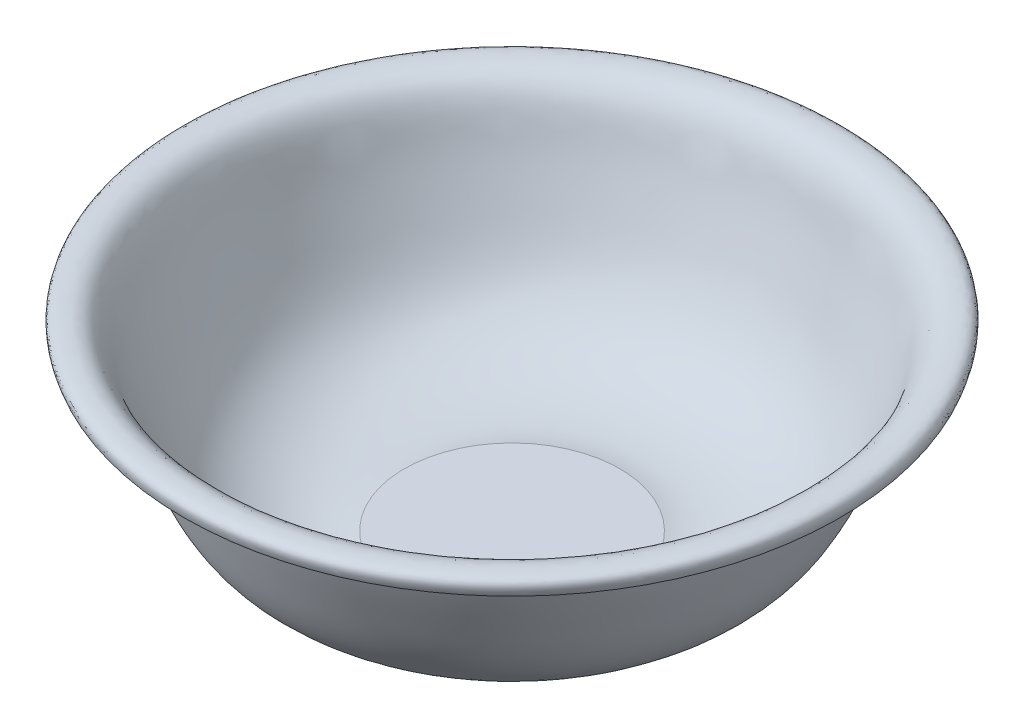
ISO-10303-21;
HEADER;
FILE_DESCRIPTION(('STEP AP214'),'2;1');
FILE_NAME('part.step','',(''),(''),'','','');
FILE_SCHEMA(('AUTOMOTIVE_DESIGN { 1 0 10303 214 1 1 1 1 }'));
ENDSEC;
DATA;
#1=APPLICATION_CONTEXT('core data for automotive mechanical design processes');
#2=APPLICATION_PROTOCOL_DEFINITION('international standard','automotive_design',2000,#1);
#3=PRODUCT_CONTEXT('',#1,'mechanical');
#4=PRODUCT('Part','Part','',(#3));
#5=PRODUCT_RELATED_PRODUCT_CATEGORY('part','',(#4));
#6=PRODUCT_DEFINITION_FORMATION('','',#4);
#7=PRODUCT_DEFINITION_CONTEXT('part definition',#1,'design');
#8=PRODUCT_DEFINITION('design','',#6,#7);
#9=PRODUCT_DEFINITION_SHAPE('','',#8);
#10=(LENGTH_UNIT() NAMED_UNIT(*) SI_UNIT(.MILLI.,.METRE.));
#11=(NAMED_UNIT(*) PLANE_ANGLE_UNIT() SI_UNIT($,.RADIAN.));
#12=(NAMED_UNIT(*) SI_UNIT($,.STERADIAN.) SOLID_ANGLE_UNIT());
#13=UNCERTAINTY_MEASURE_WITH_UNIT(LENGTH_MEASURE(1.E-05),#10,'distance_accuracy_value','');
#14=(GEOMETRIC_REPRESENTATION_CONTEXT(3) GLOBAL_UNCERTAINTY_ASSIGNED_CONTEXT((#13)) GLOBAL_UNIT_ASSIGNED_CONTEXT((#10,
#11,#12)) REPRESENTATION_CONTEXT('',''));
#15=CARTESIAN_POINT('',(0.,0.,0.));
#16=DIRECTION('',(0.,0.,1.));
#17=DIRECTION('',(1.,0.,0.));
#18=AXIS2_PLACEMENT_3D('',#15,#16,#17);
#19=CARTESIAN_POINT('',(30.4416365070501,-50.157452869484,0.));
#20=CARTESIAN_POINT('',(42.4206898457816,-52.3288744269568,0.));
#21=CARTESIAN_POINT('',(64.9418450758181,-46.1499018828682,0.));
#22=CARTESIAN_POINT('',(74.303208669172,-22.4406967419463,0.));
#23=CARTESIAN_POINT('',(79.7710832546777,-8.82354899265522,0.));
#24=CARTESIAN_POINT('',(82.7305851992699,2.79787392583733,0.));
#25=CARTESIAN_POINT('',(87.8875556733687,3.90647068305841,0.));
#26=CARTESIAN_POINT('',(92.453959786208,3.89940782190008,0.));
#27=CARTESIAN_POINT('',(92.7561073610018,3.14313737029255,0.));
#28=CARTESIAN_POINT('',(91.9274378383579,0.847140159789018,0.));
#29=B_SPLINE_CURVE_WITH_KNOTS('',3,(#19,#20,#21,#22,#23,#24,#25,#26,#27,#28),.UNSPECIFIED.,.F.,
.F.,(4,1,1,1,1,1,1,4),(0.,0.388789947569049,0.60478663671279,0.746924938844824,
0.877571777183215,0.906245875300164,0.91508680687656,1.),.UNSPECIFIED.);
#30=CARTESIAN_POINT('',(0.,0.,0.));
#31=DIRECTION('',(0.,1.,0.));
#32=AXIS1_PLACEMENT('',#30,#31);
#33=SURFACE_OF_REVOLUTION('',#29,#32);
#34=CARTESIAN_POINT('',(0.,0.847140159789018,0.));
#35=DIRECTION('',(0.,1.,0.));
#36=DIRECTION('',(0.,0.,1.));
#37=AXIS2_PLACEMENT_3D('',#34,#35,#36);
#38=CIRCLE('',#37,91.9274378383579);
#39=CARTESIAN_POINT('',(0.,0.847140159789018,91.9274378383579));
#40=VERTEX_POINT('',#39);
#41=EDGE_CURVE('E48',#40,#40,#38,.T.);
#42=ORIENTED_EDGE('',*,*,#41,.F.);
#43=EDGE_LOOP('',(#42));
#44=FACE_BOUND('',#43,.T.);
#45=CARTESIAN_POINT('',(0.,-50.157452869484,0.));
#46=DIRECTION('',(0.,1.,0.));
#47=DIRECTION('',(0.,0.,1.));
#48=AXIS2_PLACEMENT_3D('',#45,#46,#47);
#49=CIRCLE('',#48,30.4416365070501);
#50=CARTESIAN_POINT('',(0.,-50.157452869484,30.4416365070501));
#51=VERTEX_POINT('',#50);
#52=EDGE_CURVE('E10',#51,#51,#49,.T.);
#53=ORIENTED_EDGE('',*,*,#52,.T.);
#54=EDGE_LOOP('',(#53));
#55=FACE_BOUND('',#54,.T.);
#56=ADVANCED_FACE('F33',(#44,#55),#33,.T.);
#57=CARTESIAN_POINT('',(30.4416365070501,-50.157452869484,0.));
#58=DIRECTION('',(0.,1.,0.));
#59=DIRECTION('',(0.,0.,1.));
#60=AXIS2_PLACEMENT_3D('',#57,#58,#59);
#61=PLANE('',#60);
#62=ORIENTED_EDGE('',*,*,#52,.F.);
#63=EDGE_LOOP('',(#62));
#64=FACE_BOUND('',#63,.T.);
#65=ADVANCED_FACE('F71',(#64),#61,.F.);
#66=CARTESIAN_POINT('',(30.4416365070501,-49.1574528694839,0.));
#67=DIRECTION('',(0.,1.,0.));
#68=DIRECTION('',(0.,0.,1.));
#69=AXIS2_PLACEMENT_3D('',#66,#67,#68);
#70=PLANE('',#69);
#71=CARTESIAN_POINT('',(0.,-49.1574528694839,0.));
#72=DIRECTION('',(0.,1.,0.));
#73=DIRECTION('',(0.,0.,1.));
#74=AXIS2_PLACEMENT_3D('',#71,#72,#73);
#75=CIRCLE('',#74,30.5315380807149);
#76=CARTESIAN_POINT('',(0.,-49.1574528694839,30.5315380807149));
#77=VERTEX_POINT('',#76);
#78=EDGE_CURVE('E40',#77,#77,#75,.T.);
#79=ORIENTED_EDGE('',*,*,#78,.T.);
#80=EDGE_LOOP('',(#79));
#81=FACE_BOUND('',#80,.T.);
#82=ADVANCED_FACE('F68',(#81),#70,.T.);
#83=CARTESIAN_POINT('',(30.5315380807149,-49.157452869484,0.));
#84=CARTESIAN_POINT('',(30.6520091965861,-49.1792904530274,0.));
#85=CARTESIAN_POINT('',(30.7680826077167,-49.2002006268085,0.));
#86=CARTESIAN_POINT('',(31.0027761073121,-49.2407886231914,0.));
#87=CARTESIAN_POINT('',(31.3555864991626,-49.299871477187,0.));
#88=CARTESIAN_POINT('',(32.1840131692153,-49.4251438257074,0.));
#89=CARTESIAN_POINT('',(32.9023641078088,-49.5109642071762,0.));
#90=CARTESIAN_POINT('',(34.3483608745878,-49.6539370304442,0.));
#91=CARTESIAN_POINT('',(35.3247528473225,-49.7110241792399,0.));
#92=CARTESIAN_POINT('',(38.2771908267393,-49.7683445960125,0.));
#93=CARTESIAN_POINT('',(40.2764933526441,-49.6545819266259,0.));
#94=CARTESIAN_POINT('',(46.2558530986363,-48.8655136892709,0.));
#95=CARTESIAN_POINT('',(50.2168661900793,-47.7417449929989,0.));
#96=CARTESIAN_POINT('',(57.4994028297124,-44.3611991192148,0.));
#97=CARTESIAN_POINT('',(60.8197641513105,-42.1053252037803,0.));
#98=CARTESIAN_POINT('',(64.219687641551,-38.6258715364604,0.));
#99=CARTESIAN_POINT('',(64.8605597104671,-37.8968366028693,0.));
#100=CARTESIAN_POINT('',(66.0733597353956,-36.3709080926969,0.));
#101=CARTESIAN_POINT('',(66.6455956721429,-35.5754111552388,0.));
#102=CARTESIAN_POINT('',(68.2739571725486,-33.1094971972506,0.));
#103=CARTESIAN_POINT('',(69.2416061627618,-31.3595229830328,0.));
#104=CARTESIAN_POINT('',(71.0172908527797,-27.7502209523066,0.));
#105=CARTESIAN_POINT('',(71.8252947645953,-25.8910703366124,0.));
#106=CARTESIAN_POINT('',(72.9776326231456,-23.0992045817316,0.));
#107=CARTESIAN_POINT('',(73.3518325493496,-22.1680587070417,0.));
#108=CARTESIAN_POINT('',(74.0908127348659,-20.3177010603392,0.));
#109=CARTESIAN_POINT('',(74.4565120639905,-19.4007892999653,0.));
#110=CARTESIAN_POINT('',(75.540433893285,-16.6733833486264,0.));
#111=CARTESIAN_POINT('',(76.2453941595201,-14.875798202156,0.));
#112=CARTESIAN_POINT('',(77.274408122639,-12.0794658882782,0.));
#113=CARTESIAN_POINT('',(77.6126979359871,-11.1306574194395,0.));
#114=CARTESIAN_POINT('',(78.2796666089273,-9.17747910733211,0.));
#115=CARTESIAN_POINT('',(78.6074049564512,-8.1748806850367,0.));
#116=CARTESIAN_POINT('',(79.2571064799222,-6.08415418205997,0.));
#117=CARTESIAN_POINT('',(79.5838979320053,-4.99201729912079,0.));
#118=CARTESIAN_POINT('',(80.3067909325605,-2.82685962193769,0.));
#119=CARTESIAN_POINT('',(80.702596406015,-1.75363759950672,0.));
#120=CARTESIAN_POINT('',(81.6423071463664,0.269267230739664,0.));
#121=CARTESIAN_POINT('',(82.1859436953333,1.22053885823224,0.));
#122=CARTESIAN_POINT('',(83.191125322233,2.4678915898401,0.));
#123=CARTESIAN_POINT('',(83.558195690719,2.85346531322108,0.));
#124=CARTESIAN_POINT('',(84.3685658420995,3.54175760550761,0.));
#125=CARTESIAN_POINT('',(84.8121362351092,3.8442629220316,0.));
#126=CARTESIAN_POINT('',(85.7787956239759,4.33872412202928,0.));
#127=CARTESIAN_POINT('',(86.2991783723941,4.52746897680098,0.));
#128=CARTESIAN_POINT('',(87.3974751321995,4.78921472629855,0.));
#129=CARTESIAN_POINT('',(87.9765726319618,4.86374482868459,0.));
#130=CARTESIAN_POINT('',(88.8950094753798,4.9033539096669,0.));
#131=CARTESIAN_POINT('',(89.2037732856903,4.90438363178426,0.));
#132=CARTESIAN_POINT('',(89.7788432000818,4.89428877236953,0.));
#133=CARTESIAN_POINT('',(90.0449267581339,4.88368221623563,0.));
#134=CARTESIAN_POINT('',(90.7964636293181,4.83156275948959,0.));
#135=CARTESIAN_POINT('',(91.2309908188526,4.77223124142043,0.));
#136=CARTESIAN_POINT('',(91.8313521151516,4.60088854159419,0.));
#137=CARTESIAN_POINT('',(92.0235036480902,4.5293488072744,0.));
#138=CARTESIAN_POINT('',(92.392759553511,4.33849378476643,0.));
#139=CARTESIAN_POINT('',(92.5704238636983,4.21793183539949,0.));
#140=CARTESIAN_POINT('',(92.8855290700292,3.91527005297557,0.));
#141=CARTESIAN_POINT('',(93.0206434672958,3.73273267021128,0.));
#142=CARTESIAN_POINT('',(93.2159567615886,3.33962560308803,0.));
#143=CARTESIAN_POINT('',(93.2762661487685,3.13181778382158,0.));
#144=CARTESIAN_POINT('',(93.3380601269477,2.72613816144738,0.));
#145=CARTESIAN_POINT('',(93.3410494344001,2.52764620117861,0.));
#146=CARTESIAN_POINT('',(93.3137335682807,2.13722533372463,0.));
#147=CARTESIAN_POINT('',(93.2833532771475,1.94458070545355,0.));
#148=CARTESIAN_POINT('',(93.1579954215411,1.35804798365812,0.));
#149=CARTESIAN_POINT('',(93.0290469402184,0.953731800559405,0.));
#150=CARTESIAN_POINT('',(92.8680493842904,0.507655374182361,0.));
#151=B_SPLINE_CURVE_WITH_KNOTS('',3,(#83,#84,#85,#86,#87,#88,#89,#90,#91,#92,#93,#94,#95,#96,
#97,#98,#99,#100,#101,#102,#103,#104,#105,#106,#107,#108,#109,#110,#111,#112,#113,#114,#115,
#116,#117,#118,#119,#120,#121,#122,#123,#124,#125,#126,#127,#128,#129,#130,#131,#132,#133,#134,
#135,#136,#137,#138,#139,#140,#141,#142,#143,#144,#145,#146,#147,#148,#149,#150),.UNSPECIFIED.,
.F.,.F.,(4,2,1,1,2,2,2,2,2,2,2,2,2,2,2,2,2,2,2,2,2,2,2,2,2,2,2,2,2,2,2,2,2,2,4),(0.,
0.00390624999999995,0.00781249999999989,0.0156249999999998,0.0312499999999996,
0.0624999999999994,0.124999999999999,0.249999999999999,0.374999999999999,0.406249999999999,
0.437499999999999,0.499999999999998,0.562499999999998,0.593749999999998,0.624999999999998,
0.687499999999998,0.718749999999998,0.749999999999998,0.781249999999998,0.812499999999998,
0.843749999999998,0.859374999999998,0.874999999999998,0.890624999999998,0.906249999999998,
0.914062499999998,0.921874999999998,0.937499999999999,0.945312499999999,0.953124999999999,
0.960937499999999,0.968749999999999,0.9765625,0.984375,1.),.UNSPECIFIED.);
#152=CARTESIAN_POINT('',(0.,0.,0.));
#153=DIRECTION('',(0.,1.,0.));
#154=AXIS1_PLACEMENT('',#152,#153);
#155=SURFACE_OF_REVOLUTION('',#151,#154);
#156=CARTESIAN_POINT('',(0.,0.507655374182361,0.));
#157=DIRECTION('',(0.,1.,0.));
#158=DIRECTION('',(0.,0.,1.));
#159=AXIS2_PLACEMENT_3D('',#156,#157,#158);
#160=CIRCLE('',#159,92.8680493842904);
#161=CARTESIAN_POINT('',(0.,0.507655374182361,92.8680493842904));
#162=VERTEX_POINT('',#161);
#163=EDGE_CURVE('E44',#162,#162,#160,.T.);
#164=ORIENTED_EDGE('',*,*,#163,.T.);
#165=EDGE_LOOP('',(#164));
#166=FACE_BOUND('',#165,.T.);
#167=ORIENTED_EDGE('',*,*,#78,.F.);
#168=EDGE_LOOP('',(#167));
#169=FACE_BOUND('',#168,.T.);
#170=ADVANCED_FACE('F63',(#166,#169),#155,.F.);
#171=CARTESIAN_POINT('',(0.,0.507655374182361,0.));
#172=DIRECTION('',(0.,-1.,0.));
#173=DIRECTION('',(0.,0.,-1.));
#174=AXIS2_PLACEMENT_3D('',#171,#172,#173);
#175=CONICAL_SURFACE('',#174,92.8680493842904,1.22442722751467);
#176=ORIENTED_EDGE('',*,*,#41,.T.);
#177=EDGE_LOOP('',(#176));
#178=FACE_BOUND('',#177,.T.);
#179=ORIENTED_EDGE('',*,*,#163,.F.);
#180=EDGE_LOOP('',(#179));
#181=FACE_BOUND('',#180,.T.);
#182=ADVANCED_FACE('F67',(#178,#181),#175,.F.);
#183=CLOSED_SHELL('',(#56,#65,#82,#170,#182));
#184=MANIFOLD_SOLID_BREP('B2',#183);
#185=ADVANCED_BREP_SHAPE_REPRESENTATION('',(#18,#184),#14);
#186=SHAPE_DEFINITION_REPRESENTATION(#9,#185);
ENDSEC;
END-ISO-10303-21;
